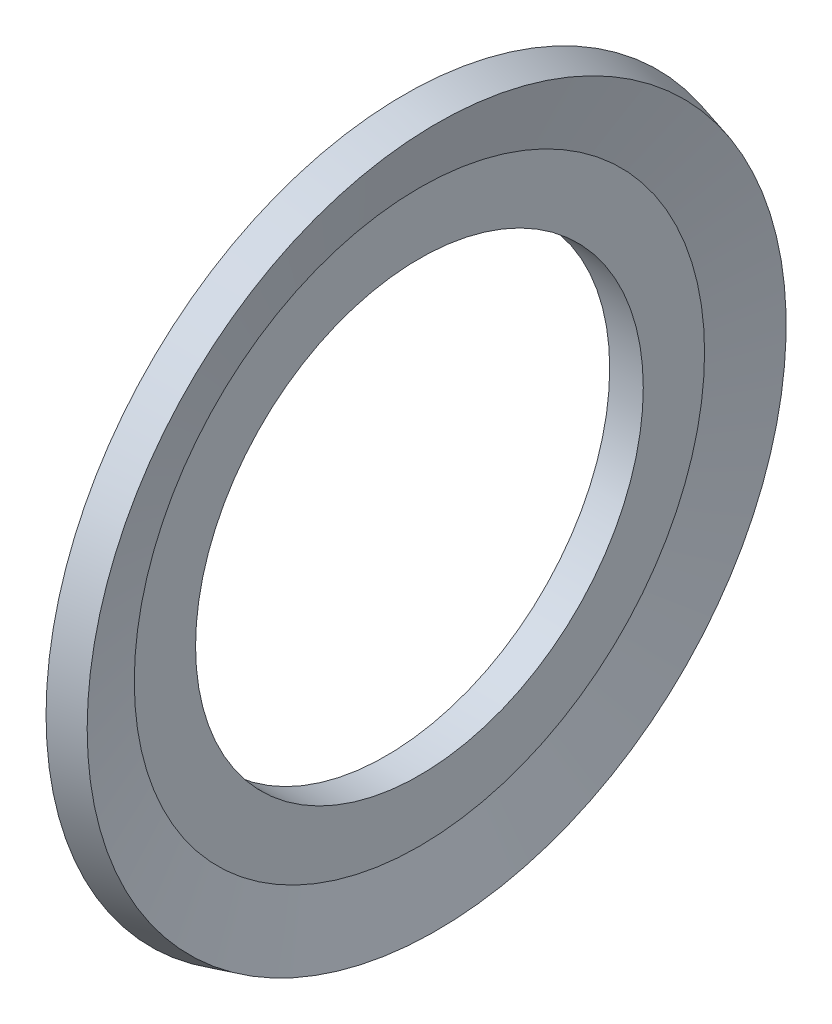
ISO-10303-21;
HEADER;
FILE_DESCRIPTION(('STEP AP214'),'2;1');
FILE_NAME('part.step','',(''),(''),'','','');
FILE_SCHEMA(('AUTOMOTIVE_DESIGN { 1 0 10303 214 1 1 1 1 }'));
ENDSEC;
DATA;
#1=APPLICATION_CONTEXT('core data for automotive mechanical design processes');
#2=APPLICATION_PROTOCOL_DEFINITION('international standard','automotive_design',2000,#1);
#3=PRODUCT_CONTEXT('',#1,'mechanical');
#4=PRODUCT('Part','Part','',(#3));
#5=PRODUCT_RELATED_PRODUCT_CATEGORY('part','',(#4));
#6=PRODUCT_DEFINITION_FORMATION('','',#4);
#7=PRODUCT_DEFINITION_CONTEXT('part definition',#1,'design');
#8=PRODUCT_DEFINITION('design','',#6,#7);
#9=PRODUCT_DEFINITION_SHAPE('','',#8);
#10=(LENGTH_UNIT() NAMED_UNIT(*) SI_UNIT(.MILLI.,.METRE.));
#11=(NAMED_UNIT(*) PLANE_ANGLE_UNIT() SI_UNIT($,.RADIAN.));
#12=(NAMED_UNIT(*) SI_UNIT($,.STERADIAN.) SOLID_ANGLE_UNIT());
#13=UNCERTAINTY_MEASURE_WITH_UNIT(LENGTH_MEASURE(1.E-05),#10,'distance_accuracy_value','');
#14=(GEOMETRIC_REPRESENTATION_CONTEXT(3) GLOBAL_UNCERTAINTY_ASSIGNED_CONTEXT((#13)) GLOBAL_UNIT_ASSIGNED_CONTEXT((#10,
#11,#12)) REPRESENTATION_CONTEXT('',''));
#15=CARTESIAN_POINT('',(0.,0.,0.));
#16=DIRECTION('',(0.,0.,1.));
#17=DIRECTION('',(1.,0.,0.));
#18=AXIS2_PLACEMENT_3D('',#15,#16,#17);
#19=CARTESIAN_POINT('',(0.,0.,0.));
#20=DIRECTION('',(-1.,0.,0.));
#21=DIRECTION('',(0.,0.,1.));
#22=AXIS2_PLACEMENT_3D('',#19,#20,#21);
#23=CYLINDRICAL_SURFACE('',#22,10.);
#24=CARTESIAN_POINT('',(1.5,0.,0.));
#25=DIRECTION('',(-1.,0.,0.));
#26=DIRECTION('',(0.,0.,1.));
#27=AXIS2_PLACEMENT_3D('',#24,#25,#26);
#28=CIRCLE('',#27,10.);
#29=CARTESIAN_POINT('',(1.5,0.,10.));
#30=VERTEX_POINT('',#29);
#31=EDGE_CURVE('E55',#30,#30,#28,.T.);
#32=ORIENTED_EDGE('',*,*,#31,.F.);
#33=EDGE_LOOP('',(#32));
#34=FACE_BOUND('',#33,.T.);
#35=CARTESIAN_POINT('',(0.,0.,0.));
#36=DIRECTION('',(-1.,0.,0.));
#37=DIRECTION('',(0.,0.,1.));
#38=AXIS2_PLACEMENT_3D('',#35,#36,#37);
#39=CIRCLE('',#38,10.);
#40=CARTESIAN_POINT('',(0.,0.,10.));
#41=VERTEX_POINT('',#40);
#42=EDGE_CURVE('E10',#41,#41,#39,.T.);
#43=ORIENTED_EDGE('',*,*,#42,.T.);
#44=EDGE_LOOP('',(#43));
#45=FACE_BOUND('',#44,.T.);
#46=ADVANCED_FACE('F33',(#34,#45),#23,.F.);
#47=CARTESIAN_POINT('',(0.,10.,0.));
#48=DIRECTION('',(1.,0.,0.));
#49=DIRECTION('',(0.,0.,-1.));
#50=AXIS2_PLACEMENT_3D('',#47,#48,#49);
#51=PLANE('',#50);
#52=ORIENTED_EDGE('',*,*,#42,.F.);
#53=EDGE_LOOP('',(#52));
#54=FACE_BOUND('',#53,.T.);
#55=CARTESIAN_POINT('',(0.,0.,0.));
#56=DIRECTION('',(-1.,0.,0.));
#57=DIRECTION('',(0.,0.,1.));
#58=AXIS2_PLACEMENT_3D('',#55,#56,#57);
#59=CIRCLE('',#58,12.935);
#60=CARTESIAN_POINT('',(0.,0.,12.935));
#61=VERTEX_POINT('',#60);
#62=EDGE_CURVE('E39',#61,#61,#59,.T.);
#63=ORIENTED_EDGE('',*,*,#62,.T.);
#64=EDGE_LOOP('',(#63));
#65=FACE_BOUND('',#64,.T.);
#66=ADVANCED_FACE('F62',(#54,#65),#51,.F.);
#67=CARTESIAN_POINT('',(0.821264274801392,0.,0.));
#68=DIRECTION('',(1.,0.,0.));
#69=DIRECTION('',(0.,0.,-1.));
#70=AXIS2_PLACEMENT_3D('',#67,#68,#69);
#71=CONICAL_SURFACE('',#70,16.,1.30899693899575);
#72=ORIENTED_EDGE('',*,*,#62,.F.);
#73=EDGE_LOOP('',(#72));
#74=FACE_BOUND('',#73,.T.);
#75=CARTESIAN_POINT('',(0.821264274801392,0.,0.));
#76=DIRECTION('',(-1.,0.,0.));
#77=DIRECTION('',(0.,0.,1.));
#78=AXIS2_PLACEMENT_3D('',#75,#76,#77);
#79=CIRCLE('',#78,16.);
#80=CARTESIAN_POINT('',(0.821264274801392,0.,16.));
#81=VERTEX_POINT('',#80);
#82=EDGE_CURVE('E43',#81,#81,#79,.T.);
#83=ORIENTED_EDGE('',*,*,#82,.T.);
#84=EDGE_LOOP('',(#83));
#85=FACE_BOUND('',#84,.T.);
#86=ADVANCED_FACE('F66',(#74,#85),#71,.T.);
#87=CARTESIAN_POINT('',(2.27015301423499,0.,0.));
#88=DIRECTION('',(-1.,0.,0.));
#89=DIRECTION('',(0.,0.,1.));
#90=AXIS2_PLACEMENT_3D('',#87,#88,#89);
#91=CONICAL_SURFACE('',#90,15.6117714323462,0.261799387799149);
#92=ORIENTED_EDGE('',*,*,#82,.F.);
#93=EDGE_LOOP('',(#92));
#94=FACE_BOUND('',#93,.T.);
#95=CARTESIAN_POINT('',(2.27015301423499,0.,0.));
#96=DIRECTION('',(-1.,0.,0.));
#97=DIRECTION('',(0.,0.,1.));
#98=AXIS2_PLACEMENT_3D('',#95,#96,#97);
#99=CIRCLE('',#98,15.6117714323462);
#100=CARTESIAN_POINT('',(2.27015301423499,0.,15.6117714323462));
#101=VERTEX_POINT('',#100);
#102=EDGE_CURVE('E47',#101,#101,#99,.T.);
#103=ORIENTED_EDGE('',*,*,#102,.T.);
#104=EDGE_LOOP('',(#103));
#105=FACE_BOUND('',#104,.T.);
#106=ADVANCED_FACE('F71',(#94,#105),#91,.T.);
#107=CARTESIAN_POINT('',(1.5,0.,0.));
#108=DIRECTION('',(1.,0.,0.));
#109=DIRECTION('',(0.,0.,-1.));
#110=AXIS2_PLACEMENT_3D('',#107,#108,#109);
#111=CONICAL_SURFACE('',#110,12.7375212536189,1.30899693899575);
#112=ORIENTED_EDGE('',*,*,#102,.F.);
#113=EDGE_LOOP('',(#112));
#114=FACE_BOUND('',#113,.T.);
#115=CARTESIAN_POINT('',(1.5,0.,0.));
#116=DIRECTION('',(-1.,0.,0.));
#117=DIRECTION('',(0.,0.,1.));
#118=AXIS2_PLACEMENT_3D('',#115,#116,#117);
#119=CIRCLE('',#118,12.7375212536189);
#120=CARTESIAN_POINT('',(1.5,0.,12.7375212536189));
#121=VERTEX_POINT('',#120);
#122=EDGE_CURVE('E52',#121,#121,#119,.T.);
#123=ORIENTED_EDGE('',*,*,#122,.T.);
#124=EDGE_LOOP('',(#123));
#125=FACE_BOUND('',#124,.T.);
#126=ADVANCED_FACE('F77',(#114,#125),#111,.F.);
#127=CARTESIAN_POINT('',(1.5,12.7375212536189,0.));
#128=DIRECTION('',(-1.,0.,0.));
#129=DIRECTION('',(0.,0.,1.));
#130=AXIS2_PLACEMENT_3D('',#127,#128,#129);
#131=PLANE('',#130);
#132=ORIENTED_EDGE('',*,*,#122,.F.);
#133=EDGE_LOOP('',(#132));
#134=FACE_BOUND('',#133,.T.);
#135=ORIENTED_EDGE('',*,*,#31,.T.);
#136=EDGE_LOOP('',(#135));
#137=FACE_BOUND('',#136,.T.);
#138=ADVANCED_FACE('F59',(#134,#137),#131,.F.);
#139=CLOSED_SHELL('',(#46,#66,#86,#106,#126,#138));
#140=MANIFOLD_SOLID_BREP('B2',#139);
#141=ADVANCED_BREP_SHAPE_REPRESENTATION('',(#18,#140),#14);
#142=SHAPE_DEFINITION_REPRESENTATION(#9,#141);
ENDSEC;
END-ISO-10303-21;
